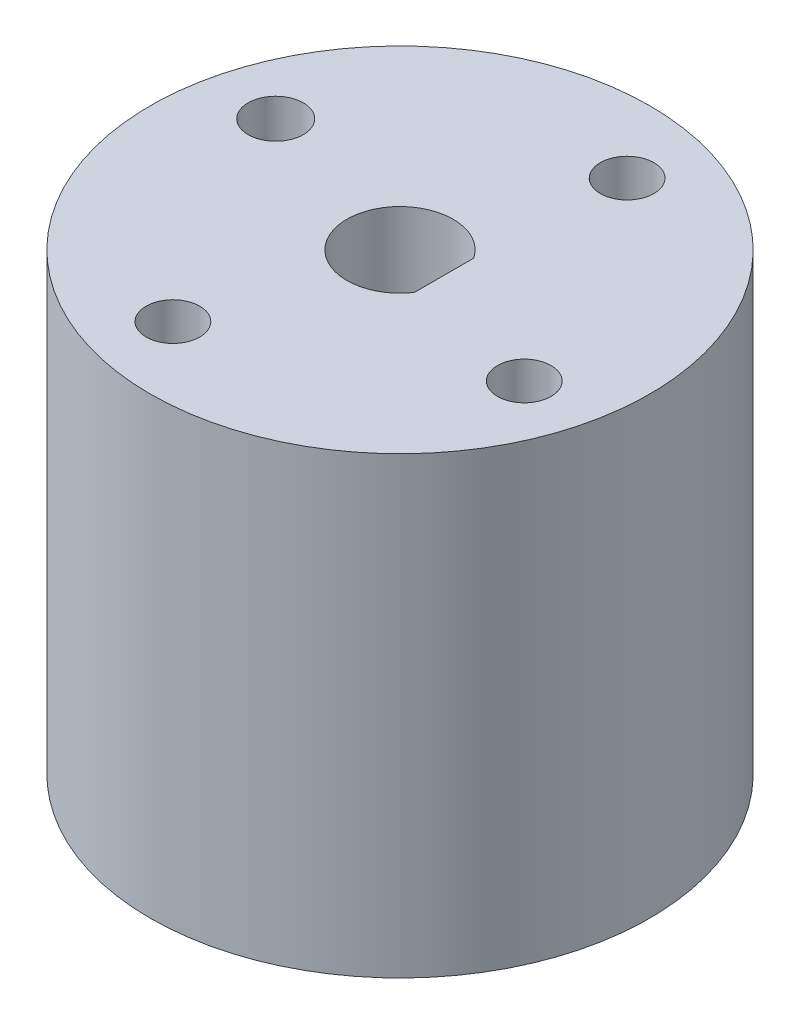
ISO-10303-21;
HEADER;
FILE_DESCRIPTION(('STEP AP214'),'2;1');
FILE_NAME('part.step','',(''),(''),'','','');
FILE_SCHEMA(('AUTOMOTIVE_DESIGN { 1 0 10303 214 1 1 1 1 }'));
ENDSEC;
DATA;
#1=APPLICATION_CONTEXT('core data for automotive mechanical design processes');
#2=APPLICATION_PROTOCOL_DEFINITION('international standard','automotive_design',2000,#1);
#3=PRODUCT_CONTEXT('',#1,'mechanical');
#4=PRODUCT('Part','Part','',(#3));
#5=PRODUCT_RELATED_PRODUCT_CATEGORY('part','',(#4));
#6=PRODUCT_DEFINITION_FORMATION('','',#4);
#7=PRODUCT_DEFINITION_CONTEXT('part definition',#1,'design');
#8=PRODUCT_DEFINITION('design','',#6,#7);
#9=PRODUCT_DEFINITION_SHAPE('','',#8);
#10=(LENGTH_UNIT() NAMED_UNIT(*) SI_UNIT(.MILLI.,.METRE.));
#11=(NAMED_UNIT(*) PLANE_ANGLE_UNIT() SI_UNIT($,.RADIAN.));
#12=(NAMED_UNIT(*) SI_UNIT($,.STERADIAN.) SOLID_ANGLE_UNIT());
#13=UNCERTAINTY_MEASURE_WITH_UNIT(LENGTH_MEASURE(1.E-05),#10,'distance_accuracy_value','');
#14=(GEOMETRIC_REPRESENTATION_CONTEXT(3) GLOBAL_UNCERTAINTY_ASSIGNED_CONTEXT((#13)) GLOBAL_UNIT_ASSIGNED_CONTEXT((#10,
#11,#12)) REPRESENTATION_CONTEXT('',''));
#15=CARTESIAN_POINT('',(0.,0.,0.));
#16=DIRECTION('',(0.,0.,1.));
#17=DIRECTION('',(1.,0.,0.));
#18=AXIS2_PLACEMENT_3D('',#15,#16,#17);
#19=CARTESIAN_POINT('',(0.,25.4,0.));
#20=DIRECTION('',(0.,1.,0.));
#21=DIRECTION('',(0.,0.,1.));
#22=AXIS2_PLACEMENT_3D('',#19,#20,#21);
#23=PLANE('',#22);
#24=CARTESIAN_POINT('',(-2.87622670808483,25.4,9.82818980762167));
#25=DIRECTION('',(0.,1.,0.));
#26=DIRECTION('',(0.,0.,1.));
#27=AXIS2_PLACEMENT_3D('',#24,#25,#26);
#28=CIRCLE('',#27,1.5);
#29=CARTESIAN_POINT('',(-2.87622670808483,25.4,11.3281898076217));
#30=VERTEX_POINT('',#29);
#31=EDGE_CURVE('E78',#30,#30,#28,.T.);
#32=ORIENTED_EDGE('',*,*,#31,.F.);
#33=EDGE_LOOP('',(#32));
#34=FACE_BOUND('',#33,.T.);
#35=CARTESIAN_POINT('',(2.87622670808476,25.4,-9.82818980762169));
#36=DIRECTION('',(0.,1.,0.));
#37=DIRECTION('',(0.,0.,1.));
#38=AXIS2_PLACEMENT_3D('',#35,#36,#37);
#39=CIRCLE('',#38,1.5);
#40=CARTESIAN_POINT('',(2.87622670808476,25.4,-8.32818980762169));
#41=VERTEX_POINT('',#40);
#42=EDGE_CURVE('E90',#41,#41,#39,.T.);
#43=ORIENTED_EDGE('',*,*,#42,.F.);
#44=EDGE_LOOP('',(#43));
#45=FACE_BOUND('',#44,.T.);
#46=CARTESIAN_POINT('',(0.,25.4,0.));
#47=DIRECTION('',(0.,1.,0.));
#48=DIRECTION('',(0.,0.,1.));
#49=AXIS2_PLACEMENT_3D('',#46,#47,#48);
#50=CIRCLE('',#49,13.97);
#51=CARTESIAN_POINT('',(0.,25.4,13.97));
#52=VERTEX_POINT('',#51);
#53=EDGE_CURVE('E96',#52,#52,#50,.T.);
#54=ORIENTED_EDGE('',*,*,#53,.T.);
#55=EDGE_LOOP('',(#54));
#56=FACE_BOUND('',#55,.T.);
#57=CARTESIAN_POINT('',(-9.8281898076217,25.4,-2.87622670808473));
#58=DIRECTION('',(0.,1.,0.));
#59=DIRECTION('',(0.,0.,1.));
#60=AXIS2_PLACEMENT_3D('',#57,#58,#59);
#61=CIRCLE('',#60,1.54392849314281);
#62=CARTESIAN_POINT('',(-9.8281898076217,25.4,-1.33229821494191));
#63=VERTEX_POINT('',#62);
#64=EDGE_CURVE('E84',#63,#63,#61,.T.);
#65=ORIENTED_EDGE('',*,*,#64,.F.);
#66=EDGE_LOOP('',(#65));
#67=FACE_BOUND('',#66,.T.);
#68=CARTESIAN_POINT('',(9.82818980762168,25.4,2.8762267080848));
#69=DIRECTION('',(0.,1.,0.));
#70=DIRECTION('',(0.,0.,1.));
#71=AXIS2_PLACEMENT_3D('',#68,#69,#70);
#72=CIRCLE('',#71,1.5);
#73=CARTESIAN_POINT('',(9.82818980762168,25.4,4.3762267080848));
#74=VERTEX_POINT('',#73);
#75=EDGE_CURVE('E72',#74,#74,#72,.T.);
#76=ORIENTED_EDGE('',*,*,#75,.F.);
#77=EDGE_LOOP('',(#76));
#78=FACE_BOUND('',#77,.T.);
#79=CARTESIAN_POINT('',(0.,25.4,0.));
#80=DIRECTION('',(0.,1.,0.));
#81=DIRECTION('',(0.,0.,1.));
#82=AXIS2_PLACEMENT_3D('',#79,#80,#81);
#83=CIRCLE('',#82,2.97209821013869);
#84=CARTESIAN_POINT('',(2.46531291537395,25.4,-1.66));
#85=VERTEX_POINT('',#84);
#86=CARTESIAN_POINT('',(2.46531291537395,25.4,1.66));
#87=VERTEX_POINT('',#86);
#88=EDGE_CURVE('E65',#85,#87,#83,.T.);
#89=ORIENTED_EDGE('',*,*,#88,.F.);
#90=DIRECTION('',(0.,0.,1.));
#91=VECTOR('',#90,1.);
#92=CARTESIAN_POINT('',(2.46531291537395,25.4,0.));
#93=LINE('',#92,#91);
#94=EDGE_CURVE('E47',#85,#87,#93,.T.);
#95=ORIENTED_EDGE('',*,*,#94,.T.);
#96=EDGE_LOOP('',(#89,#95));
#97=FACE_BOUND('',#96,.T.);
#98=ADVANCED_FACE('F32',(#34,#45,#56,#67,#78,#97),#23,.T.);
#99=CARTESIAN_POINT('',(0.,0.,0.));
#100=DIRECTION('',(0.,1.,0.));
#101=DIRECTION('',(0.,0.,1.));
#102=AXIS2_PLACEMENT_3D('',#99,#100,#101);
#103=PLANE('',#102);
#104=CARTESIAN_POINT('',(9.82818980762168,0.,2.8762267080848));
#105=DIRECTION('',(0.,1.,0.));
#106=DIRECTION('',(0.,0.,1.));
#107=AXIS2_PLACEMENT_3D('',#104,#105,#106);
#108=CIRCLE('',#107,1.5);
#109=CARTESIAN_POINT('',(9.82818980762168,0.,4.3762267080848));
#110=VERTEX_POINT('',#109);
#111=EDGE_CURVE('E61',#110,#110,#108,.T.);
#112=ORIENTED_EDGE('',*,*,#111,.T.);
#113=EDGE_LOOP('',(#112));
#114=FACE_BOUND('',#113,.T.);
#115=CARTESIAN_POINT('',(-2.87622670808483,0.,9.82818980762167));
#116=DIRECTION('',(0.,1.,0.));
#117=DIRECTION('',(0.,0.,1.));
#118=AXIS2_PLACEMENT_3D('',#115,#116,#117);
#119=CIRCLE('',#118,1.5);
#120=CARTESIAN_POINT('',(-2.87622670808483,0.,11.3281898076217));
#121=VERTEX_POINT('',#120);
#122=EDGE_CURVE('E75',#121,#121,#119,.T.);
#123=ORIENTED_EDGE('',*,*,#122,.T.);
#124=EDGE_LOOP('',(#123));
#125=FACE_BOUND('',#124,.T.);
#126=CARTESIAN_POINT('',(-9.8281898076217,0.,-2.87622670808473));
#127=DIRECTION('',(0.,1.,0.));
#128=DIRECTION('',(0.,0.,1.));
#129=AXIS2_PLACEMENT_3D('',#126,#127,#128);
#130=CIRCLE('',#129,1.54392849314281);
#131=CARTESIAN_POINT('',(-9.8281898076217,0.,-1.33229821494191));
#132=VERTEX_POINT('',#131);
#133=EDGE_CURVE('E81',#132,#132,#130,.T.);
#134=ORIENTED_EDGE('',*,*,#133,.T.);
#135=EDGE_LOOP('',(#134));
#136=FACE_BOUND('',#135,.T.);
#137=CARTESIAN_POINT('',(2.87622670808476,0.,-9.82818980762169));
#138=DIRECTION('',(0.,1.,0.));
#139=DIRECTION('',(0.,0.,1.));
#140=AXIS2_PLACEMENT_3D('',#137,#138,#139);
#141=CIRCLE('',#140,1.5);
#142=CARTESIAN_POINT('',(2.87622670808476,0.,-8.32818980762169));
#143=VERTEX_POINT('',#142);
#144=EDGE_CURVE('E87',#143,#143,#141,.T.);
#145=ORIENTED_EDGE('',*,*,#144,.T.);
#146=EDGE_LOOP('',(#145));
#147=FACE_BOUND('',#146,.T.);
#148=CARTESIAN_POINT('',(0.,0.,0.));
#149=DIRECTION('',(0.,1.,0.));
#150=DIRECTION('',(0.,0.,1.));
#151=AXIS2_PLACEMENT_3D('',#148,#149,#150);
#152=CIRCLE('',#151,13.97);
#153=CARTESIAN_POINT('',(0.,0.,13.97));
#154=VERTEX_POINT('',#153);
#155=EDGE_CURVE('E93',#154,#154,#152,.T.);
#156=ORIENTED_EDGE('',*,*,#155,.F.);
#157=EDGE_LOOP('',(#156));
#158=FACE_BOUND('',#157,.T.);
#159=DIRECTION('',(0.,0.,1.));
#160=VECTOR('',#159,1.);
#161=CARTESIAN_POINT('',(2.46531291537395,0.,0.));
#162=LINE('',#161,#160);
#163=CARTESIAN_POINT('',(2.46531291537395,0.,-1.66));
#164=VERTEX_POINT('',#163);
#165=CARTESIAN_POINT('',(2.46531291537395,0.,1.66));
#166=VERTEX_POINT('',#165);
#167=EDGE_CURVE('E11',#164,#166,#162,.T.);
#168=ORIENTED_EDGE('',*,*,#167,.F.);
#169=CARTESIAN_POINT('',(0.,0.,0.));
#170=DIRECTION('',(0.,1.,0.));
#171=DIRECTION('',(0.,0.,1.));
#172=AXIS2_PLACEMENT_3D('',#169,#170,#171);
#173=CIRCLE('',#172,2.97209821013869);
#174=EDGE_CURVE('E40',#164,#166,#173,.T.);
#175=ORIENTED_EDGE('',*,*,#174,.T.);
#176=EDGE_LOOP('',(#168,#175));
#177=FACE_BOUND('',#176,.T.);
#178=ADVANCED_FACE('F101',(#114,#125,#136,#147,#158,#177),#103,.F.);
#179=CARTESIAN_POINT('',(0.,25.4,0.));
#180=DIRECTION('',(0.,-1.,0.));
#181=DIRECTION('',(0.,0.,-1.));
#182=AXIS2_PLACEMENT_3D('',#179,#180,#181);
#183=CYLINDRICAL_SURFACE('',#182,13.97);
#184=ORIENTED_EDGE('',*,*,#53,.F.);
#185=EDGE_LOOP('',(#184));
#186=FACE_BOUND('',#185,.T.);
#187=ORIENTED_EDGE('',*,*,#155,.T.);
#188=EDGE_LOOP('',(#187));
#189=FACE_BOUND('',#188,.T.);
#190=ADVANCED_FACE('F34',(#186,#189),#183,.T.);
#191=CARTESIAN_POINT('',(2.87622670808476,25.4,-9.82818980762169));
#192=DIRECTION('',(0.,-1.,0.));
#193=DIRECTION('',(0.,0.,-1.));
#194=AXIS2_PLACEMENT_3D('',#191,#192,#193);
#195=CYLINDRICAL_SURFACE('',#194,1.5);
#196=ORIENTED_EDGE('',*,*,#42,.T.);
#197=EDGE_LOOP('',(#196));
#198=FACE_BOUND('',#197,.T.);
#199=ORIENTED_EDGE('',*,*,#144,.F.);
#200=EDGE_LOOP('',(#199));
#201=FACE_BOUND('',#200,.T.);
#202=ADVANCED_FACE('F108',(#198,#201),#195,.F.);
#203=CARTESIAN_POINT('',(-9.8281898076217,25.4,-2.87622670808473));
#204=DIRECTION('',(0.,-1.,0.));
#205=DIRECTION('',(0.,0.,-1.));
#206=AXIS2_PLACEMENT_3D('',#203,#204,#205);
#207=CYLINDRICAL_SURFACE('',#206,1.54392849314281);
#208=ORIENTED_EDGE('',*,*,#64,.T.);
#209=EDGE_LOOP('',(#208));
#210=FACE_BOUND('',#209,.T.);
#211=ORIENTED_EDGE('',*,*,#133,.F.);
#212=EDGE_LOOP('',(#211));
#213=FACE_BOUND('',#212,.T.);
#214=ADVANCED_FACE('F116',(#210,#213),#207,.F.);
#215=CARTESIAN_POINT('',(-2.87622670808483,25.4,9.82818980762167));
#216=DIRECTION('',(0.,-1.,0.));
#217=DIRECTION('',(0.,0.,-1.));
#218=AXIS2_PLACEMENT_3D('',#215,#216,#217);
#219=CYLINDRICAL_SURFACE('',#218,1.5);
#220=ORIENTED_EDGE('',*,*,#31,.T.);
#221=EDGE_LOOP('',(#220));
#222=FACE_BOUND('',#221,.T.);
#223=ORIENTED_EDGE('',*,*,#122,.F.);
#224=EDGE_LOOP('',(#223));
#225=FACE_BOUND('',#224,.T.);
#226=ADVANCED_FACE('F120',(#222,#225),#219,.F.);
#227=CARTESIAN_POINT('',(9.82818980762168,25.4,2.8762267080848));
#228=DIRECTION('',(0.,-1.,0.));
#229=DIRECTION('',(0.,0.,-1.));
#230=AXIS2_PLACEMENT_3D('',#227,#228,#229);
#231=CYLINDRICAL_SURFACE('',#230,1.5);
#232=ORIENTED_EDGE('',*,*,#75,.T.);
#233=EDGE_LOOP('',(#232));
#234=FACE_BOUND('',#233,.T.);
#235=ORIENTED_EDGE('',*,*,#111,.F.);
#236=EDGE_LOOP('',(#235));
#237=FACE_BOUND('',#236,.T.);
#238=ADVANCED_FACE('F124',(#234,#237),#231,.F.);
#239=CARTESIAN_POINT('',(2.46531291537395,-4.6,0.));
#240=DIRECTION('',(-1.,0.,0.));
#241=DIRECTION('',(0.,0.,1.));
#242=AXIS2_PLACEMENT_3D('',#239,#240,#241);
#243=PLANE('',#242);
#244=ORIENTED_EDGE('',*,*,#167,.T.);
#245=DIRECTION('',(0.,1.,0.));
#246=VECTOR('',#245,1.);
#247=CARTESIAN_POINT('',(2.46531291537395,-4.6,1.66));
#248=LINE('',#247,#246);
#249=EDGE_CURVE('E54',#166,#87,#248,.T.);
#250=ORIENTED_EDGE('',*,*,#249,.T.);
#251=ORIENTED_EDGE('',*,*,#94,.F.);
#252=DIRECTION('',(0.,1.,0.));
#253=VECTOR('',#252,1.);
#254=CARTESIAN_POINT('',(2.46531291537395,-4.6,-1.66));
#255=LINE('',#254,#253);
#256=EDGE_CURVE('E62',#164,#85,#255,.T.);
#257=ORIENTED_EDGE('',*,*,#256,.F.);
#258=EDGE_LOOP('',(#244,#250,#251,#257));
#259=FACE_BOUND('',#258,.T.);
#260=ADVANCED_FACE('F58',(#259),#243,.T.);
#261=CARTESIAN_POINT('',(0.,-4.6,0.));
#262=DIRECTION('',(0.,1.,0.));
#263=DIRECTION('',(0.,0.,1.));
#264=AXIS2_PLACEMENT_3D('',#261,#262,#263);
#265=CYLINDRICAL_SURFACE('',#264,2.97209821013869);
#266=ORIENTED_EDGE('',*,*,#256,.T.);
#267=ORIENTED_EDGE('',*,*,#88,.T.);
#268=ORIENTED_EDGE('',*,*,#249,.F.);
#269=ORIENTED_EDGE('',*,*,#174,.F.);
#270=EDGE_LOOP('',(#266,#267,#268,#269));
#271=FACE_BOUND('',#270,.T.);
#272=ADVANCED_FACE('F66',(#271),#265,.F.);
#273=CLOSED_SHELL('',(#98,#178,#190,#202,#214,#226,#238,#260,#272));
#274=MANIFOLD_SOLID_BREP('B2',#273);
#275=ADVANCED_BREP_SHAPE_REPRESENTATION('',(#18,#274),#14);
#276=SHAPE_DEFINITION_REPRESENTATION(#9,#275);
ENDSEC;
END-ISO-10303-21;
